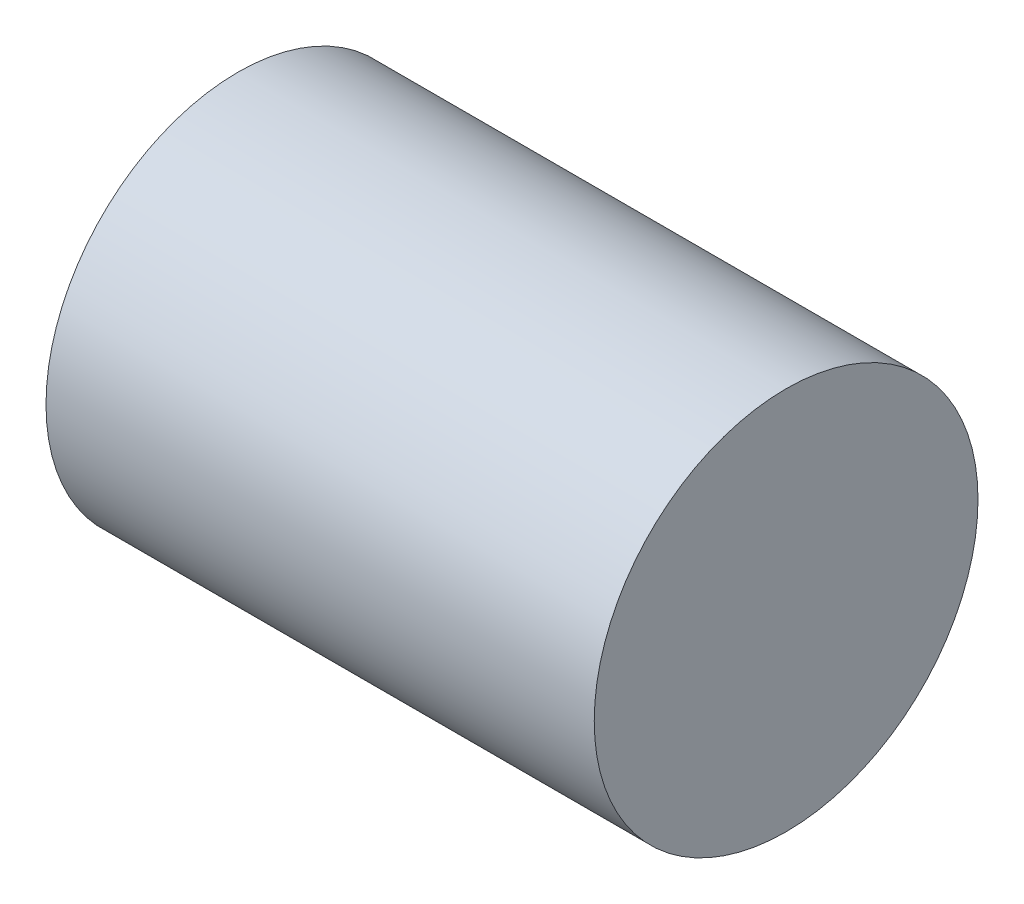
ISO-10303-21;
HEADER;
FILE_DESCRIPTION(('STEP AP214'),'2;1');
FILE_NAME('part.step','',(''),(''),'','','');
FILE_SCHEMA(('AUTOMOTIVE_DESIGN { 1 0 10303 214 1 1 1 1 }'));
ENDSEC;
DATA;
#1=APPLICATION_CONTEXT('core data for automotive mechanical design processes');
#2=APPLICATION_PROTOCOL_DEFINITION('international standard','automotive_design',2000,#1);
#3=PRODUCT_CONTEXT('',#1,'mechanical');
#4=PRODUCT('Part','Part','',(#3));
#5=PRODUCT_RELATED_PRODUCT_CATEGORY('part','',(#4));
#6=PRODUCT_DEFINITION_FORMATION('','',#4);
#7=PRODUCT_DEFINITION_CONTEXT('part definition',#1,'design');
#8=PRODUCT_DEFINITION('design','',#6,#7);
#9=PRODUCT_DEFINITION_SHAPE('','',#8);
#10=(LENGTH_UNIT() NAMED_UNIT(*) SI_UNIT(.MILLI.,.METRE.));
#11=(NAMED_UNIT(*) PLANE_ANGLE_UNIT() SI_UNIT($,.RADIAN.));
#12=(NAMED_UNIT(*) SI_UNIT($,.STERADIAN.) SOLID_ANGLE_UNIT());
#13=UNCERTAINTY_MEASURE_WITH_UNIT(LENGTH_MEASURE(1.E-05),#10,'distance_accuracy_value','');
#14=(GEOMETRIC_REPRESENTATION_CONTEXT(3) GLOBAL_UNCERTAINTY_ASSIGNED_CONTEXT((#13)) GLOBAL_UNIT_ASSIGNED_CONTEXT((#10,
#11,#12)) REPRESENTATION_CONTEXT('',''));
#15=CARTESIAN_POINT('',(0.,0.,0.));
#16=DIRECTION('',(0.,0.,1.));
#17=DIRECTION('',(1.,0.,0.));
#18=AXIS2_PLACEMENT_3D('',#15,#16,#17);
#19=CARTESIAN_POINT('',(40.,0.,0.));
#20=DIRECTION('',(-1.,0.,0.));
#21=DIRECTION('',(0.,0.,1.));
#22=AXIS2_PLACEMENT_3D('',#19,#20,#21);
#23=CYLINDRICAL_SURFACE('',#22,14.);
#24=CARTESIAN_POINT('',(40.,0.,0.));
#25=DIRECTION('',(1.,0.,0.));
#26=DIRECTION('',(0.,0.,-1.));
#27=AXIS2_PLACEMENT_3D('',#24,#25,#26);
#28=CIRCLE('',#27,14.);
#29=CARTESIAN_POINT('',(40.,0.,-14.));
#30=VERTEX_POINT('',#29);
#31=EDGE_CURVE('E37',#30,#30,#28,.T.);
#32=ORIENTED_EDGE('',*,*,#31,.F.);
#33=EDGE_LOOP('',(#32));
#34=FACE_BOUND('',#33,.T.);
#35=CARTESIAN_POINT('',(0.,0.,0.));
#36=DIRECTION('',(1.,0.,0.));
#37=DIRECTION('',(0.,0.,-1.));
#38=AXIS2_PLACEMENT_3D('',#35,#36,#37);
#39=CIRCLE('',#38,14.);
#40=CARTESIAN_POINT('',(0.,0.,-14.));
#41=VERTEX_POINT('',#40);
#42=EDGE_CURVE('E41',#41,#41,#39,.T.);
#43=ORIENTED_EDGE('',*,*,#42,.T.);
#44=EDGE_LOOP('',(#43));
#45=FACE_BOUND('',#44,.T.);
#46=ADVANCED_FACE('F31',(#34,#45),#23,.T.);
#47=CARTESIAN_POINT('',(40.,0.,0.));
#48=DIRECTION('',(1.,0.,0.));
#49=DIRECTION('',(0.,0.,-1.));
#50=AXIS2_PLACEMENT_3D('',#47,#48,#49);
#51=PLANE('',#50);
#52=ORIENTED_EDGE('',*,*,#31,.T.);
#53=EDGE_LOOP('',(#52));
#54=FACE_BOUND('',#53,.T.);
#55=ADVANCED_FACE('F62',(#54),#51,.T.);
#56=CARTESIAN_POINT('',(0.,0.,0.));
#57=DIRECTION('',(1.,0.,0.));
#58=DIRECTION('',(0.,0.,-1.));
#59=AXIS2_PLACEMENT_3D('',#56,#57,#58);
#60=PLANE('',#59);
#61=CARTESIAN_POINT('',(0.,0.,0.));
#62=DIRECTION('',(1.,0.,0.));
#63=DIRECTION('',(0.,0.,-1.));
#64=AXIS2_PLACEMENT_3D('',#61,#62,#63);
#65=CIRCLE('',#64,1.15);
#66=CARTESIAN_POINT('',(0.,0.,-1.15));
#67=VERTEX_POINT('',#66);
#68=EDGE_CURVE('E10',#67,#67,#65,.F.);
#69=ORIENTED_EDGE('',*,*,#68,.F.);
#70=EDGE_LOOP('',(#69));
#71=FACE_BOUND('',#70,.T.);
#72=ORIENTED_EDGE('',*,*,#42,.F.);
#73=EDGE_LOOP('',(#72));
#74=FACE_BOUND('',#73,.T.);
#75=ADVANCED_FACE('F55',(#71,#74),#60,.F.);
#76=CARTESIAN_POINT('',(-6.5,0.,0.));
#77=DIRECTION('',(1.,0.,0.));
#78=DIRECTION('',(0.,0.,-1.));
#79=AXIS2_PLACEMENT_3D('',#76,#77,#78);
#80=CYLINDRICAL_SURFACE('',#79,1.15);
#81=CARTESIAN_POINT('',(-6.5,0.,0.));
#82=DIRECTION('',(-1.,0.,0.));
#83=DIRECTION('',(0.,0.,1.));
#84=AXIS2_PLACEMENT_3D('',#81,#82,#83);
#85=CIRCLE('',#84,1.15);
#86=CARTESIAN_POINT('',(-6.5,0.,-1.15));
#87=VERTEX_POINT('',#86);
#88=EDGE_CURVE('E46',#87,#87,#85,.T.);
#89=CARTESIAN_POINT('',(-6.5,0.,-1.15));
#90=CARTESIAN_POINT('',(-6.43229166666667,0.,-1.15));
#91=CARTESIAN_POINT('',(-6.36458333333333,0.,-1.15));
#92=CARTESIAN_POINT('',(-6.22916666666667,0.,-1.15));
#93=CARTESIAN_POINT('',(-6.16145833333333,0.,-1.15));
#94=CARTESIAN_POINT('',(-6.02604166666667,0.,-1.15));
#95=CARTESIAN_POINT('',(-5.95833333333333,0.,-1.15));
#96=CARTESIAN_POINT('',(-5.82291666666667,0.,-1.15));
#97=CARTESIAN_POINT('',(-5.75520833333333,0.,-1.15));
#98=CARTESIAN_POINT('',(-5.61979166666667,0.,-1.15));
#99=CARTESIAN_POINT('',(-5.55208333333333,0.,-1.15));
#100=CARTESIAN_POINT('',(-5.41666666666667,0.,-1.15));
#101=CARTESIAN_POINT('',(-5.34895833333333,0.,-1.15));
#102=CARTESIAN_POINT('',(-5.21354166666667,0.,-1.15));
#103=CARTESIAN_POINT('',(-5.14583333333333,0.,-1.15));
#104=CARTESIAN_POINT('',(-5.01041666666667,0.,-1.15));
#105=CARTESIAN_POINT('',(-4.94270833333333,0.,-1.15));
#106=CARTESIAN_POINT('',(-4.80729166666667,0.,-1.15));
#107=CARTESIAN_POINT('',(-4.73958333333333,0.,-1.15));
#108=CARTESIAN_POINT('',(-4.60416666666667,0.,-1.15));
#109=CARTESIAN_POINT('',(-4.53645833333333,0.,-1.15));
#110=CARTESIAN_POINT('',(-4.40104166666667,0.,-1.15));
#111=CARTESIAN_POINT('',(-4.33333333333333,0.,-1.15));
#112=CARTESIAN_POINT('',(-4.19791666666667,0.,-1.15));
#113=CARTESIAN_POINT('',(-4.13020833333333,0.,-1.15));
#114=CARTESIAN_POINT('',(-3.99479166666667,0.,-1.15));
#115=CARTESIAN_POINT('',(-3.92708333333333,0.,-1.15));
#116=CARTESIAN_POINT('',(-3.79166666666667,0.,-1.15));
#117=CARTESIAN_POINT('',(-3.72395833333333,0.,-1.15));
#118=CARTESIAN_POINT('',(-3.58854166666667,0.,-1.15));
#119=CARTESIAN_POINT('',(-3.52083333333333,0.,-1.15));
#120=CARTESIAN_POINT('',(-3.38541666666667,0.,-1.15));
#121=CARTESIAN_POINT('',(-3.31770833333333,0.,-1.15));
#122=CARTESIAN_POINT('',(-3.18229166666667,0.,-1.15));
#123=CARTESIAN_POINT('',(-3.11458333333333,0.,-1.15));
#124=CARTESIAN_POINT('',(-2.97916666666667,0.,-1.15));
#125=CARTESIAN_POINT('',(-2.91145833333333,0.,-1.15));
#126=CARTESIAN_POINT('',(-2.77604166666667,0.,-1.15));
#127=CARTESIAN_POINT('',(-2.70833333333333,0.,-1.15));
#128=CARTESIAN_POINT('',(-2.57291666666667,0.,-1.15));
#129=CARTESIAN_POINT('',(-2.50520833333333,0.,-1.15));
#130=CARTESIAN_POINT('',(-2.36979166666667,0.,-1.15));
#131=CARTESIAN_POINT('',(-2.30208333333333,0.,-1.15));
#132=CARTESIAN_POINT('',(-2.16666666666667,0.,-1.15));
#133=CARTESIAN_POINT('',(-2.09895833333333,0.,-1.15));
#134=CARTESIAN_POINT('',(-1.96354166666667,0.,-1.15));
#135=CARTESIAN_POINT('',(-1.89583333333333,0.,-1.15));
#136=CARTESIAN_POINT('',(-1.76041666666667,0.,-1.15));
#137=CARTESIAN_POINT('',(-1.69270833333333,0.,-1.15));
#138=CARTESIAN_POINT('',(-1.55729166666667,0.,-1.15));
#139=CARTESIAN_POINT('',(-1.48958333333333,0.,-1.15));
#140=CARTESIAN_POINT('',(-1.35416666666667,0.,-1.15));
#141=CARTESIAN_POINT('',(-1.28645833333333,0.,-1.15));
#142=CARTESIAN_POINT('',(-1.15104166666667,0.,-1.15));
#143=CARTESIAN_POINT('',(-1.08333333333333,0.,-1.15));
#144=CARTESIAN_POINT('',(-0.947916666666667,0.,-1.15));
#145=CARTESIAN_POINT('',(-0.880208333333333,0.,-1.15));
#146=CARTESIAN_POINT('',(-0.744791666666667,0.,-1.15));
#147=CARTESIAN_POINT('',(-0.677083333333333,0.,-1.15));
#148=CARTESIAN_POINT('',(-0.541666666666667,0.,-1.15));
#149=CARTESIAN_POINT('',(-0.473958333333333,0.,-1.15));
#150=CARTESIAN_POINT('',(-0.338541666666667,0.,-1.15));
#151=CARTESIAN_POINT('',(-0.270833333333334,0.,-1.15));
#152=CARTESIAN_POINT('',(-0.135416666666667,0.,-1.15));
#153=CARTESIAN_POINT('',(-0.0677083333333334,0.,-1.15));
#154=CARTESIAN_POINT('',(0.,0.,-1.15));
#155=B_SPLINE_CURVE_WITH_KNOTS('',3,(#89,#90,#91,#92,#93,#94,#95,#96,#97,#98,#99,#100,#101,#102,
#103,#104,#105,#106,#107,#108,#109,#110,#111,#112,#113,#114,#115,#116,#117,#118,#119,#120,#121,
#122,#123,#124,#125,#126,#127,#128,#129,#130,#131,#132,#133,#134,#135,#136,#137,#138,#139,#140,
#141,#142,#143,#144,#145,#146,#147,#148,#149,#150,#151,#152,#153,#154),.UNSPECIFIED.,.F.,.F.,(4,
2,2,2,2,2,2,2,2,2,2,2,2,2,2,2,2,2,2,2,2,2,2,2,2,2,2,2,2,2,2,2,4),(0.,0.203125,0.40625,
0.609375000000001,0.812500000000001,1.015625,1.21875,1.421875,1.625,1.828125,2.03125,2.234375,
2.4375,2.640625,2.84375,3.046875,3.25,3.453125,3.65625,3.859375,4.0625,4.265625,4.46875,
4.671875,4.875,5.078125,5.28125,5.484375,5.6875,5.890625,6.09375,6.296875,6.5),.UNSPECIFIED.);
#156=EDGE_CURVE('BSEAM53',#87,#67,#155,.T.);
#157=ORIENTED_EDGE('',*,*,#88,.F.);
#158=ORIENTED_EDGE('',*,*,#68,.T.);
#159=ORIENTED_EDGE('',*,*,#156,.T.);
#160=ORIENTED_EDGE('',*,*,#156,.F.);
#161=EDGE_LOOP('',(#157,#159,#158,#160));
#162=FACE_BOUND('',#161,.T.);
#163=ADVANCED_FACE('F53',(#162),#80,.T.);
#164=CARTESIAN_POINT('',(-6.5,0.,0.));
#165=DIRECTION('',(-1.,0.,0.));
#166=DIRECTION('',(0.,0.,1.));
#167=AXIS2_PLACEMENT_3D('',#164,#165,#166);
#168=PLANE('',#167);
#169=ORIENTED_EDGE('',*,*,#88,.T.);
#170=EDGE_LOOP('',(#169));
#171=FACE_BOUND('',#170,.T.);
#172=ADVANCED_FACE('F51',(#171),#168,.T.);
#173=CLOSED_SHELL('',(#46,#55,#75,#163,#172));
#174=MANIFOLD_SOLID_BREP('B2',#173);
#175=ADVANCED_BREP_SHAPE_REPRESENTATION('',(#18,#174),#14);
#176=SHAPE_DEFINITION_REPRESENTATION(#9,#175);
ENDSEC;
END-ISO-10303-21;
